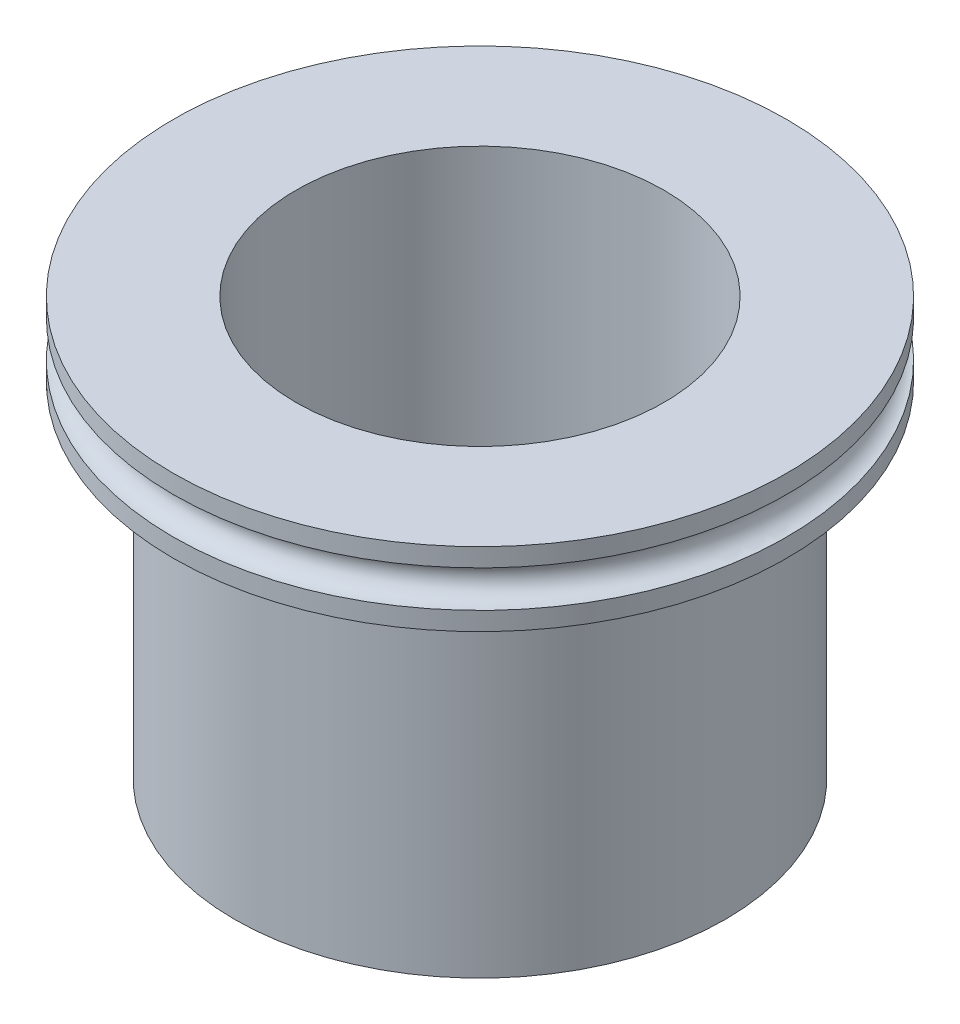
ISO-10303-21;
HEADER;
FILE_DESCRIPTION(('STEP AP214'),'2;1');
FILE_NAME('part.step','',(''),(''),'','','');
FILE_SCHEMA(('AUTOMOTIVE_DESIGN { 1 0 10303 214 1 1 1 1 }'));
ENDSEC;
DATA;
#1=APPLICATION_CONTEXT('core data for automotive mechanical design processes');
#2=APPLICATION_PROTOCOL_DEFINITION('international standard','automotive_design',2000,#1);
#3=PRODUCT_CONTEXT('',#1,'mechanical');
#4=PRODUCT('Part','Part','',(#3));
#5=PRODUCT_RELATED_PRODUCT_CATEGORY('part','',(#4));
#6=PRODUCT_DEFINITION_FORMATION('','',#4);
#7=PRODUCT_DEFINITION_CONTEXT('part definition',#1,'design');
#8=PRODUCT_DEFINITION('design','',#6,#7);
#9=PRODUCT_DEFINITION_SHAPE('','',#8);
#10=(LENGTH_UNIT() NAMED_UNIT(*) SI_UNIT(.MILLI.,.METRE.));
#11=(NAMED_UNIT(*) PLANE_ANGLE_UNIT() SI_UNIT($,.RADIAN.));
#12=(NAMED_UNIT(*) SI_UNIT($,.STERADIAN.) SOLID_ANGLE_UNIT());
#13=UNCERTAINTY_MEASURE_WITH_UNIT(LENGTH_MEASURE(1.E-05),#10,'distance_accuracy_value','');
#14=(GEOMETRIC_REPRESENTATION_CONTEXT(3) GLOBAL_UNCERTAINTY_ASSIGNED_CONTEXT((#13)) GLOBAL_UNIT_ASSIGNED_CONTEXT((#10,
#11,#12)) REPRESENTATION_CONTEXT('',''));
#15=CARTESIAN_POINT('',(0.,0.,0.));
#16=DIRECTION('',(0.,0.,1.));
#17=DIRECTION('',(1.,0.,0.));
#18=AXIS2_PLACEMENT_3D('',#15,#16,#17);
#19=CARTESIAN_POINT('',(0.,-1.5,0.));
#20=DIRECTION('',(0.,1.,0.));
#21=DIRECTION('',(0.,0.,1.));
#22=AXIS2_PLACEMENT_3D('',#19,#20,#21);
#23=PLANE('',#22);
#24=CARTESIAN_POINT('',(0.,-1.5,0.));
#25=DIRECTION('',(0.,1.,0.));
#26=DIRECTION('',(0.,0.,1.));
#27=AXIS2_PLACEMENT_3D('',#24,#25,#26);
#28=CIRCLE('',#27,12.5);
#29=CARTESIAN_POINT('',(0.,-1.5,12.5));
#30=VERTEX_POINT('',#29);
#31=EDGE_CURVE('E42',#30,#30,#28,.T.);
#32=ORIENTED_EDGE('',*,*,#31,.F.);
#33=EDGE_LOOP('',(#32));
#34=FACE_BOUND('',#33,.T.);
#35=CARTESIAN_POINT('',(0.,-1.5,0.));
#36=DIRECTION('',(0.,1.,0.));
#37=DIRECTION('',(0.,0.,1.));
#38=AXIS2_PLACEMENT_3D('',#35,#36,#37);
#39=CIRCLE('',#38,10.);
#40=CARTESIAN_POINT('',(0.,-1.5,10.));
#41=VERTEX_POINT('',#40);
#42=EDGE_CURVE('E10',#41,#41,#39,.F.);
#43=ORIENTED_EDGE('',*,*,#42,.F.);
#44=EDGE_LOOP('',(#43));
#45=FACE_BOUND('',#44,.T.);
#46=ADVANCED_FACE('F31',(#34,#45),#23,.F.);
#47=CARTESIAN_POINT('',(0.,1.5,0.));
#48=DIRECTION('',(0.,-1.,0.));
#49=DIRECTION('',(0.,0.,-1.));
#50=AXIS2_PLACEMENT_3D('',#47,#48,#49);
#51=CYLINDRICAL_SURFACE('',#50,12.5);
#52=CARTESIAN_POINT('',(0.,1.5,0.));
#53=DIRECTION('',(0.,1.,0.));
#54=DIRECTION('',(0.,0.,1.));
#55=AXIS2_PLACEMENT_3D('',#52,#53,#54);
#56=CIRCLE('',#55,12.5);
#57=CARTESIAN_POINT('',(0.,1.5,12.5));
#58=VERTEX_POINT('',#57);
#59=EDGE_CURVE('E38',#58,#58,#56,.T.);
#60=ORIENTED_EDGE('',*,*,#59,.F.);
#61=EDGE_LOOP('',(#60));
#62=FACE_BOUND('',#61,.T.);
#63=CARTESIAN_POINT('',(0.,0.750000000000001,0.));
#64=DIRECTION('',(0.,-1.,0.));
#65=DIRECTION('',(0.,0.,-1.));
#66=AXIS2_PLACEMENT_3D('',#63,#64,#65);
#67=CIRCLE('',#66,12.5);
#68=CARTESIAN_POINT('',(0.,0.750000000000001,-12.5));
#69=VERTEX_POINT('',#68);
#70=EDGE_CURVE('E47',#69,#69,#67,.T.);
#71=ORIENTED_EDGE('',*,*,#70,.F.);
#72=EDGE_LOOP('',(#71));
#73=FACE_BOUND('',#72,.T.);
#74=ADVANCED_FACE('F33',(#62,#73),#51,.T.);
#75=CARTESIAN_POINT('',(0.,1.5,0.));
#76=DIRECTION('',(0.,1.,0.));
#77=DIRECTION('',(0.,0.,1.));
#78=AXIS2_PLACEMENT_3D('',#75,#76,#77);
#79=PLANE('',#78);
#80=CARTESIAN_POINT('',(0.,1.5,0.));
#81=DIRECTION('',(0.,1.,0.));
#82=DIRECTION('',(0.,0.,1.));
#83=AXIS2_PLACEMENT_3D('',#80,#81,#82);
#84=CIRCLE('',#83,7.5);
#85=CARTESIAN_POINT('',(0.,1.5,7.5));
#86=VERTEX_POINT('',#85);
#87=EDGE_CURVE('E104',#86,#86,#84,.T.);
#88=ORIENTED_EDGE('',*,*,#87,.F.);
#89=EDGE_LOOP('',(#88));
#90=FACE_BOUND('',#89,.T.);
#91=ORIENTED_EDGE('',*,*,#59,.T.);
#92=EDGE_LOOP('',(#91));
#93=FACE_BOUND('',#92,.T.);
#94=ADVANCED_FACE('F61',(#90,#93),#79,.T.);
#95=CARTESIAN_POINT('',(0.,0.,0.));
#96=DIRECTION('',(0.,1.,0.));
#97=DIRECTION('',(0.,0.,1.));
#98=AXIS2_PLACEMENT_3D('',#95,#96,#97);
#99=TOROIDAL_SURFACE('',#98,12.5,0.75);
#100=CARTESIAN_POINT('',(0.,-0.75,0.));
#101=DIRECTION('',(0.,1.,0.));
#102=DIRECTION('',(0.,0.,1.));
#103=AXIS2_PLACEMENT_3D('',#100,#101,#102);
#104=CIRCLE('',#103,12.5);
#105=CARTESIAN_POINT('',(0.,-0.75,12.5));
#106=VERTEX_POINT('',#105);
#107=EDGE_CURVE('E53',#106,#106,#104,.T.);
#108=ORIENTED_EDGE('',*,*,#107,.T.);
#109=EDGE_LOOP('',(#108));
#110=FACE_BOUND('',#109,.T.);
#111=ORIENTED_EDGE('',*,*,#70,.T.);
#112=EDGE_LOOP('',(#111));
#113=FACE_BOUND('',#112,.T.);
#114=ADVANCED_FACE('F58',(#110,#113),#99,.F.);
#115=ORIENTED_EDGE('',*,*,#31,.T.);
#116=EDGE_LOOP('',(#115));
#117=FACE_BOUND('',#116,.T.);
#118=ORIENTED_EDGE('',*,*,#107,.F.);
#119=EDGE_LOOP('',(#118));
#120=FACE_BOUND('',#119,.T.);
#121=ADVANCED_FACE('F63',(#117,#120),#51,.T.);
#122=CARTESIAN_POINT('',(0.,-15.5,0.));
#123=DIRECTION('',(0.,1.,0.));
#124=DIRECTION('',(0.,0.,1.));
#125=AXIS2_PLACEMENT_3D('',#122,#123,#124);
#126=CYLINDRICAL_SURFACE('',#125,10.);
#127=CARTESIAN_POINT('',(0.,-15.5,0.));
#128=DIRECTION('',(0.,-1.,0.));
#129=DIRECTION('',(0.,0.,-1.));
#130=AXIS2_PLACEMENT_3D('',#127,#128,#129);
#131=CIRCLE('',#130,10.);
#132=CARTESIAN_POINT('',(0.,-15.5,-10.));
#133=VERTEX_POINT('',#132);
#134=EDGE_CURVE('E50',#133,#133,#131,.T.);
#135=ORIENTED_EDGE('',*,*,#134,.F.);
#136=EDGE_LOOP('',(#135));
#137=FACE_BOUND('',#136,.T.);
#138=ORIENTED_EDGE('',*,*,#42,.T.);
#139=EDGE_LOOP('',(#138));
#140=FACE_BOUND('',#139,.T.);
#141=ADVANCED_FACE('F72',(#137,#140),#126,.T.);
#142=CARTESIAN_POINT('',(0.,-15.5,0.));
#143=DIRECTION('',(0.,-1.,0.));
#144=DIRECTION('',(0.,0.,-1.));
#145=AXIS2_PLACEMENT_3D('',#142,#143,#144);
#146=PLANE('',#145);
#147=CARTESIAN_POINT('',(0.,-15.5,0.));
#148=DIRECTION('',(0.,1.,0.));
#149=DIRECTION('',(0.,0.,1.));
#150=AXIS2_PLACEMENT_3D('',#147,#148,#149);
#151=CIRCLE('',#150,7.5);
#152=CARTESIAN_POINT('',(0.,-15.5,7.5));
#153=VERTEX_POINT('',#152);
#154=EDGE_CURVE('E101',#153,#153,#151,.T.);
#155=ORIENTED_EDGE('',*,*,#154,.T.);
#156=EDGE_LOOP('',(#155));
#157=FACE_BOUND('',#156,.T.);
#158=ORIENTED_EDGE('',*,*,#134,.T.);
#159=EDGE_LOOP('',(#158));
#160=FACE_BOUND('',#159,.T.);
#161=ADVANCED_FACE('F78',(#157,#160),#146,.T.);
#162=CARTESIAN_POINT('',(0.,-15.5,0.));
#163=DIRECTION('',(0.,1.,0.));
#164=DIRECTION('',(0.,0.,1.));
#165=AXIS2_PLACEMENT_3D('',#162,#163,#164);
#166=CYLINDRICAL_SURFACE('',#165,7.5);
#167=ORIENTED_EDGE('',*,*,#154,.F.);
#168=EDGE_LOOP('',(#167));
#169=FACE_BOUND('',#168,.T.);
#170=ORIENTED_EDGE('',*,*,#87,.T.);
#171=EDGE_LOOP('',(#170));
#172=FACE_BOUND('',#171,.T.);
#173=ADVANCED_FACE('F92',(#169,#172),#166,.F.);
#174=CLOSED_SHELL('',(#46,#74,#94,#114,#121,#141,#161,#173));
#175=MANIFOLD_SOLID_BREP('B2',#174);
#176=ADVANCED_BREP_SHAPE_REPRESENTATION('',(#18,#175),#14);
#177=SHAPE_DEFINITION_REPRESENTATION(#9,#176);
ENDSEC;
END-ISO-10303-21;
